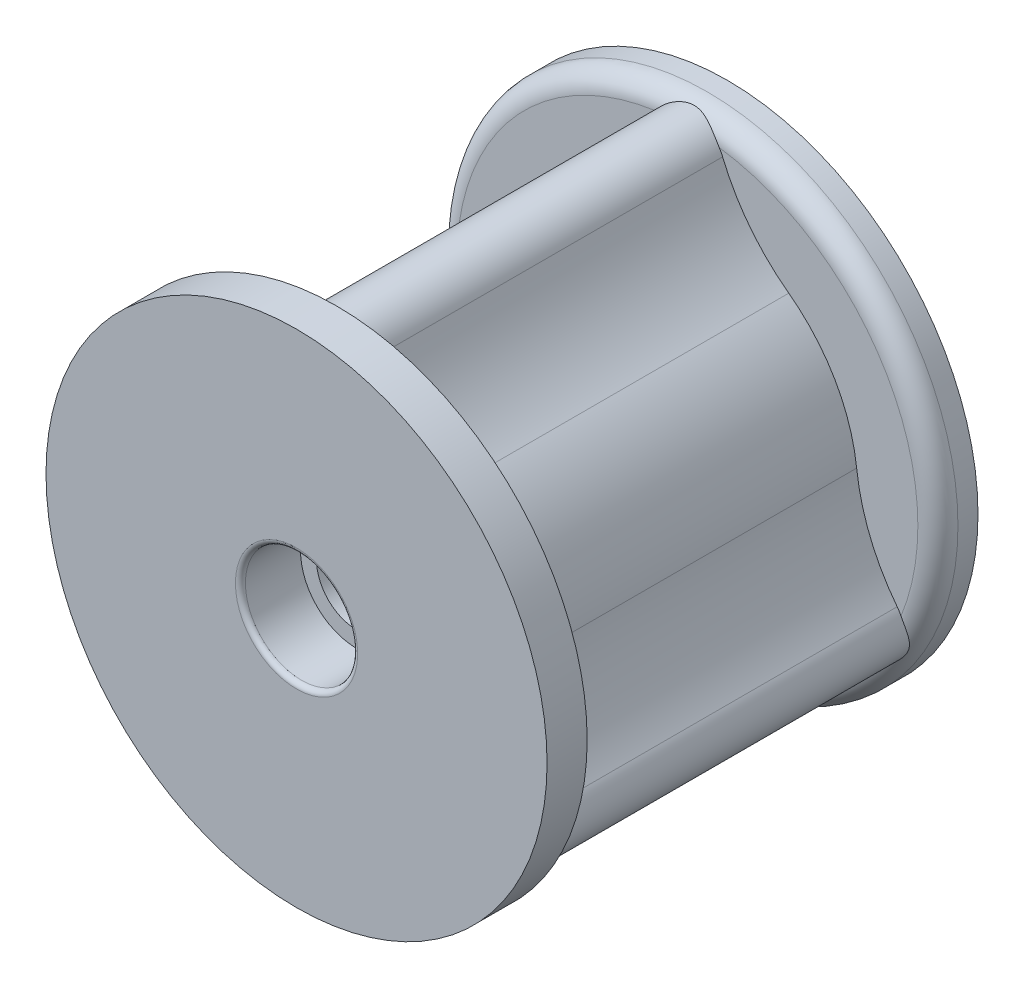
ISO-10303-21;
HEADER;
FILE_DESCRIPTION(('STEP AP214'),'2;1');
FILE_NAME('part.step','',(''),(''),'','','');
FILE_SCHEMA(('AUTOMOTIVE_DESIGN { 1 0 10303 214 1 1 1 1 }'));
ENDSEC;
DATA;
#1=APPLICATION_CONTEXT('core data for automotive mechanical design processes');
#2=APPLICATION_PROTOCOL_DEFINITION('international standard','automotive_design',2000,#1);
#3=PRODUCT_CONTEXT('',#1,'mechanical');
#4=PRODUCT('Part','Part','',(#3));
#5=PRODUCT_RELATED_PRODUCT_CATEGORY('part','',(#4));
#6=PRODUCT_DEFINITION_FORMATION('','',#4);
#7=PRODUCT_DEFINITION_CONTEXT('part definition',#1,'design');
#8=PRODUCT_DEFINITION('design','',#6,#7);
#9=PRODUCT_DEFINITION_SHAPE('','',#8);
#10=(LENGTH_UNIT() NAMED_UNIT(*) SI_UNIT(.MILLI.,.METRE.));
#11=(NAMED_UNIT(*) PLANE_ANGLE_UNIT() SI_UNIT($,.RADIAN.));
#12=(NAMED_UNIT(*) SI_UNIT($,.STERADIAN.) SOLID_ANGLE_UNIT());
#13=UNCERTAINTY_MEASURE_WITH_UNIT(LENGTH_MEASURE(1.E-05),#10,'distance_accuracy_value','');
#14=(GEOMETRIC_REPRESENTATION_CONTEXT(3) GLOBAL_UNCERTAINTY_ASSIGNED_CONTEXT((#13)) GLOBAL_UNIT_ASSIGNED_CONTEXT((#10,
#11,#12)) REPRESENTATION_CONTEXT('',''));
#15=CARTESIAN_POINT('',(0.,0.,0.));
#16=DIRECTION('',(0.,0.,1.));
#17=DIRECTION('',(1.,0.,0.));
#18=AXIS2_PLACEMENT_3D('',#15,#16,#17);
#19=CARTESIAN_POINT('',(0.,0.,11.1));
#20=DIRECTION('',(0.,0.,-1.));
#21=DIRECTION('',(-1.,0.,0.));
#22=AXIS2_PLACEMENT_3D('',#19,#20,#21);
#23=TOROIDAL_SURFACE('',#22,4.95,0.4);
#24=CARTESIAN_POINT('',(0.,0.,11.5));
#25=DIRECTION('',(0.,0.,-1.));
#26=DIRECTION('',(-1.,0.,0.));
#27=AXIS2_PLACEMENT_3D('',#24,#25,#26);
#28=CIRCLE('',#27,4.95);
#29=CARTESIAN_POINT('',(-4.95,0.,11.5));
#30=VERTEX_POINT('',#29);
#31=EDGE_CURVE('E46',#30,#30,#28,.T.);
#32=ORIENTED_EDGE('',*,*,#31,.F.);
#33=EDGE_LOOP('',(#32));
#34=FACE_BOUND('',#33,.T.);
#35=CARTESIAN_POINT('',(0.,0.,11.1));
#36=DIRECTION('',(0.,0.,-1.));
#37=DIRECTION('',(-1.,0.,0.));
#38=AXIS2_PLACEMENT_3D('',#35,#36,#37);
#39=CIRCLE('',#38,5.35);
#40=CARTESIAN_POINT('',(-5.35,0.,11.1));
#41=VERTEX_POINT('',#40);
#42=EDGE_CURVE('E11',#41,#41,#39,.F.);
#43=ORIENTED_EDGE('',*,*,#42,.F.);
#44=EDGE_LOOP('',(#43));
#45=FACE_BOUND('',#44,.T.);
#46=ADVANCED_FACE('F39',(#34,#45),#23,.F.);
#47=CARTESIAN_POINT('',(0.,0.,1.));
#48=DIRECTION('',(0.,0.,1.));
#49=DIRECTION('',(1.,0.,0.));
#50=AXIS2_PLACEMENT_3D('',#47,#48,#49);
#51=TOROIDAL_SURFACE('',#50,11.5,1.);
#52=CARTESIAN_POINT('',(0.,0.,1.));
#53=DIRECTION('',(0.,0.,1.));
#54=DIRECTION('',(1.,0.,0.));
#55=AXIS2_PLACEMENT_3D('',#52,#53,#54);
#56=CIRCLE('',#55,12.5);
#57=CARTESIAN_POINT('',(12.5,0.,1.));
#58=VERTEX_POINT('',#57);
#59=EDGE_CURVE('E270',#58,#58,#56,.F.);
#60=ORIENTED_EDGE('',*,*,#59,.F.);
#61=EDGE_LOOP('',(#60));
#62=FACE_BOUND('',#61,.T.);
#63=CARTESIAN_POINT('',(-10.6588030535764,-4.31739707058197,2.));
#64=CARTESIAN_POINT('',(-10.6781101839333,-4.35555452923911,1.99999498434355));
#65=CARTESIAN_POINT('',(-10.6960985329721,-4.39432755074247,1.99844404990182));
#66=CARTESIAN_POINT('',(-10.7293402997143,-4.4727673464099,1.99271772835113));
#67=CARTESIAN_POINT('',(-10.7445983178298,-4.51243248798381,1.98854681025949));
#68=CARTESIAN_POINT('',(-10.7860009225556,-4.63181918287956,1.97287780415423));
#69=CARTESIAN_POINT('',(-10.8080845346889,-4.71255084896907,1.95820828314791));
#70=CARTESIAN_POINT('',(-10.8462832488853,-4.89900725901992,1.91845858803093));
#71=CARTESIAN_POINT('',(-10.8587148337109,-5.00507811925763,1.89158379576156));
#72=CARTESIAN_POINT('',(-10.8658729259182,-5.21746496130839,1.83492284551103));
#73=CARTESIAN_POINT('',(-10.8605222258494,-5.32378000398095,1.80512453837247));
#74=CARTESIAN_POINT('',(-10.834223080376,-5.51846515052636,1.75360148359661));
#75=CARTESIAN_POINT('',(-10.8158448053257,-5.60704145234437,1.73134291199219));
#76=CARTESIAN_POINT('',(-10.7660969189572,-5.7818991562095,1.69436355342532));
#77=CARTESIAN_POINT('',(-10.7347867937073,-5.86818916573531,1.67960893313134));
#78=CARTESIAN_POINT('',(-10.6780654079738,-5.99474389681366,1.66636353358436));
#79=CARTESIAN_POINT('',(-10.6573706200874,-6.03670335303288,1.66343977103681));
#80=CARTESIAN_POINT('',(-10.6128874244484,-6.1190631104157,1.66090308510507));
#81=CARTESIAN_POINT('',(-10.5890992626566,-6.15946353521035,1.66128989864829));
#82=CARTESIAN_POINT('',(-10.5386473646156,-6.23833187567565,1.66534821128953));
#83=CARTESIAN_POINT('',(-10.5119794294053,-6.27679684623886,1.66902456527575));
#84=CARTESIAN_POINT('',(-10.4560825729752,-6.35142054093743,1.6793040575289));
#85=CARTESIAN_POINT('',(-10.4268519474946,-6.38757770227402,1.68590915552067));
#86=CARTESIAN_POINT('',(-10.3294562915159,-6.49946142069352,1.71088803936606));
#87=CARTESIAN_POINT('',(-10.2568364611818,-6.57034149263342,1.73385001352676));
#88=CARTESIAN_POINT('',(-10.1022616064596,-6.69917315548325,1.78455790579169));
#89=CARTESIAN_POINT('',(-10.0202781669791,-6.75708372528154,1.81231852429326));
#90=CARTESIAN_POINT('',(-9.84547983314278,-6.86096797336868,1.86762708490789));
#91=CARTESIAN_POINT('',(-9.75242072241659,-6.90654915830803,1.89514579576109));
#92=CARTESIAN_POINT('',(-9.55899678631057,-6.98218362630873,1.94344609292167));
#93=CARTESIAN_POINT('',(-9.45867629686389,-7.01232334494671,1.96426493314531));
#94=CARTESIAN_POINT('',(-9.28663137965699,-7.048624700969,1.98848585953015));
#95=CARTESIAN_POINT('',(-9.21639414408376,-7.0594167802046,1.99536820421943));
#96=CARTESIAN_POINT('',(-9.10994029578974,-7.0696772861725,1.99985289916632));
#97=CARTESIAN_POINT('',(-9.0741189842099,-7.07210704694329,2.00036427411822));
#98=CARTESIAN_POINT('',(-9.00238704104726,-7.07493995266375,1.99911309751472));
#99=CARTESIAN_POINT('',(-8.96647635525176,-7.07534015573206,1.99734724972726));
#100=CARTESIAN_POINT('',(-8.93066354132666,-7.0747185975918,1.99429648470368));
#101=B_SPLINE_CURVE_WITH_KNOTS('',3,(#63,#64,#65,#66,#67,#68,#69,#70,#71,#72,#73,#74,#75,#76,
#77,#78,#79,#80,#81,#82,#83,#84,#85,#86,#87,#88,#89,#90,#91,#92,#93,#94,#95,#96,#97,#98,#99,
#100),.UNSPECIFIED.,.F.,.F.,(4,2,2,2,2,2,2,2,2,2,2,2,2,2,2,2,2,2,4),(0.,0.128166756814913,
0.256115485608044,0.509963693243546,0.83871022167859,1.16888596936918,1.44742605879382,
1.72469889639607,1.865112929277,2.00551580435938,2.1461262362799,2.28683089786786,
2.59716304170232,2.90846328896911,3.22874279115222,3.54720934339071,3.76059047451701,
3.86819416667734,3.97595378788394),.UNSPECIFIED.);
#102=CARTESIAN_POINT('',(-10.6588030535764,-4.31739707058197,2.));
#103=VERTEX_POINT('',#102);
#104=CARTESIAN_POINT('',(-9.06837706813587,-7.07209568304244,2.));
#105=VERTEX_POINT('',#104);
#106=EDGE_CURVE('E298',#103,#105,#101,.T.);
#107=ORIENTED_EDGE('',*,*,#106,.F.);
#108=CARTESIAN_POINT('',(0.,0.,2.));
#109=DIRECTION('',(0.,0.,1.));
#110=DIRECTION('',(1.,0.,0.));
#111=AXIS2_PLACEMENT_3D('',#108,#109,#110);
#112=CIRCLE('',#111,11.5);
#113=CARTESIAN_POINT('',(-1.59042598544066,11.3894927536232,2.));
#114=VERTEX_POINT('',#113);
#115=EDGE_CURVE('E257',#114,#103,#112,.T.);
#116=ORIENTED_EDGE('',*,*,#115,.F.);
#117=CARTESIAN_POINT('',(1.59042598544066,11.3894927536232,2.));
#118=CARTESIAN_POINT('',(1.56703422207815,11.425291948315,1.99999498434355));
#119=CARTESIAN_POINT('',(1.54244997499418,11.4602568263064,1.99844404990182));
#120=CARTESIAN_POINT('',(1.49114000264963,11.5282649386056,1.99271772835113));
#121=CARTESIAN_POINT('',(1.4644179914597,11.561311340692,1.98854681025949));
#122=CARTESIAN_POINT('',(1.38172738316904,11.6568603956152,1.97287780415422));
#123=CARTESIAN_POINT('',(1.32285351551236,11.7163511977748,1.95820828314789));
#124=CARTESIAN_POINT('',(1.1804768848081,11.8426604596862,1.91845858803089));
#125=CARTESIAN_POINT('',(1.09483261765381,11.9064619580734,1.8915837957615));
#126=CARTESIAN_POINT('',(0.914479263111988,12.0188544687929,1.83492284551094));
#127=CARTESIAN_POINT('',(0.819732385318757,12.0673781479416,1.80512453837235));
#128=CARTESIAN_POINT('',(0.637980529934278,12.1419449931366,1.75360148359643));
#129=CARTESIAN_POINT('',(0.552082064861464,12.1703170909744,1.73134291199198));
#130=CARTESIAN_POINT('',(0.375776908082598,12.2146630095273,1.69436355342504));
#131=CARTESIAN_POINT('',(0.285392505115499,12.2306926504281,1.67960893313103));
#132=CARTESIAN_POINT('',(0.147432200165786,12.2448478549843,1.666363533584));
#133=CARTESIAN_POINT('',(0.100746851207737,12.2479053710583,1.66343977103643));
#134=CARTESIAN_POINT('',(0.00717961124519466,12.2505616722849,1.66090308510467));
#135=CARTESIAN_POINT('',(-0.0397022638465764,12.2501607322612,1.66128989864788));
#136=CARTESIAN_POINT('',(-0.133230199264361,12.2459022771212,1.6653482112891));
#137=CARTESIAN_POINT('',(-0.179875808533073,12.2420396530443,1.66902456527531));
#138=CARTESIAN_POINT('',(-0.272450252081365,12.2309434027334,1.67930405752845));
#139=CARTESIAN_POINT('',(-0.318378585067886,12.223707519167,1.68590915552022));
#140=CARTESIAN_POINT('',(-0.463970555478371,12.195302266081,1.71088803936561));
#141=CARTESIAN_POINT('',(-0.561664413567418,12.1678516841632,1.73385001352631));
#142=CARTESIAN_POINT('',(-0.750523333768205,12.0984017646125,1.78455790579126));
#143=CARTESIAN_POINT('',(-0.841667078101412,12.0563573082319,1.81231852429284));
#144=CARTESIAN_POINT('',(-1.01903264291605,11.9569196346341,1.86762708490751));
#145=CARTESIAN_POINT('',(-1.10503666237121,11.8991186731614,1.89514579576073));
#146=CARTESIAN_POINT('',(-1.26725000111456,11.7694258647941,1.94344609292139));
#147=CARTESIAN_POINT('',(-1.34351200784131,11.6976156317322,1.96426493314507));
#148=CARTESIAN_POINT('',(-1.46097236295196,11.5667710408502,1.98848585953001));
#149=CARTESIAN_POINT('',(-1.5054371955163,11.51133985017,1.99536820421934));
#150=CARTESIAN_POINT('',(-1.56754997848726,11.4242783662007,1.99985289916629));
#151=CARTESIAN_POINT('',(-1.58756486882983,11.3944710807611,2.00036427411821));
#152=CARTESIAN_POINT('',(-1.62588420873164,11.3337658485796,1.99911309751477));
#153=CARTESIAN_POINT('',(-1.64418613765324,11.3028663839476,1.99734724972733));
#154=CARTESIAN_POINT('',(-1.66155425947642,11.2715407982373,1.99429648470376));
#155=B_SPLINE_CURVE_WITH_KNOTS('',3,(#117,#118,#119,#120,#121,#122,#123,#124,#125,#126,#127,
#128,#129,#130,#131,#132,#133,#134,#135,#136,#137,#138,#139,#140,#141,#142,#143,#144,#145,#146,
#147,#148,#149,#150,#151,#152,#153,#154),.UNSPECIFIED.,.F.,.F.,(4,2,2,2,2,2,2,2,2,2,2,2,2,2,2,2,
2,2,4),(0.,0.128166756814914,0.256115485608046,0.50996369324355,0.83871022167858,
1.16888596936916,1.44742605879383,1.72469889639611,1.86511292927706,2.00551580435946,
2.14612623628,2.28683089786798,2.59716304170234,2.90846328896904,3.22874279115209,
3.5472093433905,3.76059047451691,3.8681941666773,3.97595378788396),.UNSPECIFIED.);
#156=CARTESIAN_POINT('',(1.59042598544066,11.3894927536232,2.));
#157=VERTEX_POINT('',#156);
#158=EDGE_CURVE('E52',#157,#114,#155,.T.);
#159=ORIENTED_EDGE('',*,*,#158,.F.);
#160=CARTESIAN_POINT('',(0.,0.,2.));
#161=DIRECTION('',(0.,0.,1.));
#162=DIRECTION('',(1.,0.,0.));
#163=AXIS2_PLACEMENT_3D('',#160,#161,#162);
#164=CIRCLE('',#163,11.5);
#165=CARTESIAN_POINT('',(10.6588030535772,-4.3173970705802,2.));
#166=VERTEX_POINT('',#165);
#167=EDGE_CURVE('E265',#166,#157,#164,.T.);
#168=ORIENTED_EDGE('',*,*,#167,.F.);
#169=CARTESIAN_POINT('',(9.0683770681364,-7.07209568304176,2.));
#170=CARTESIAN_POINT('',(9.11107596185577,-7.06973741907642,1.99999498434355));
#171=CARTESIAN_POINT('',(9.15364855797857,-7.06592927556451,1.99844404990182));
#172=CARTESIAN_POINT('',(9.23820029706532,-7.05549759219624,1.99271772835113));
#173=CARTESIAN_POINT('',(9.28018032637079,-7.04887885270876,1.98854681025948));
#174=CARTESIAN_POINT('',(9.40427353938728,-7.02504121273632,1.97287780415421));
#175=CARTESIAN_POINT('',(9.48523101917732,-7.0038003488064,1.95820828314787));
#176=CARTESIAN_POINT('',(9.66580636407798,-6.943653200667,1.91845858803085));
#177=CARTESIAN_POINT('',(9.76388221605793,-6.9013838388165,1.89158379576145));
#178=CARTESIAN_POINT('',(9.9513936628071,-6.80138950748536,1.83492284551084));
#179=CARTESIAN_POINT('',(10.0407898405316,-6.74359814396154,1.80512453837223));
#180=CARTESIAN_POINT('',(10.1962425504428,-6.62347984261116,1.75360148359625));
#181=CARTESIAN_POINT('',(10.2637627404653,-6.5632756386309,1.73134291199177));
#182=CARTESIAN_POINT('',(10.3903200108758,-6.43276385331868,1.69436355342476));
#183=CARTESIAN_POINT('',(10.449394288593,-6.36250348469372,1.67960893313071));
#184=CARTESIAN_POINT('',(10.5306332078093,-6.2501039581715,1.66636353358363));
#185=CARTESIAN_POINT('',(10.5566237688809,-6.21120201802632,1.66343977103605));
#186=CARTESIAN_POINT('',(10.6057078132045,-6.13149856187005,1.66090308510426));
#187=CARTESIAN_POINT('',(10.6288015265045,-6.09069719705166,1.66128989864746));
#188=CARTESIAN_POINT('',(10.6718775638814,-6.00757040144637,1.66534821128866));
#189=CARTESIAN_POINT('',(10.6918552379398,-5.96524280680617,1.66902456527487));
#190=CARTESIAN_POINT('',(10.728532825058,-5.8795228617967,1.67930405752801));
#191=CARTESIAN_POINT('',(10.7452305325639,-5.8361298168937,1.68590915551977));
#192=CARTESIAN_POINT('',(10.7934268469958,-5.69584084538822,1.71088803936516));
#193=CARTESIAN_POINT('',(10.8185008747508,-5.59751019153051,1.73385001352586));
#194=CARTESIAN_POINT('',(10.8527849402295,-5.39922860913006,1.78455790579082));
#195=CARTESIAN_POINT('',(10.8619452450823,-5.29927358295121,1.81231852429242));
#196=CARTESIAN_POINT('',(10.8645124760608,-5.09595166126636,1.86762708490713));
#197=CARTESIAN_POINT('',(10.8574573847898,-4.99256951485428,1.89514579576038));
#198=CARTESIAN_POINT('',(10.8262467874273,-4.78724223848623,1.9434460929211));
#199=CARTESIAN_POINT('',(10.8021883047075,-4.68529228678637,1.96426493314483));
#200=CARTESIAN_POINT('',(10.7476037426113,-4.51814633988201,1.98848585952987));
#201=CARTESIAN_POINT('',(10.7218313396024,-4.45192306996612,1.99536820421924));
#202=CARTESIAN_POINT('',(10.6774902742793,-4.35460108002881,1.99985289916626));
#203=CARTESIAN_POINT('',(10.661683853042,-4.32236403381835,2.00036427411821));
#204=CARTESIAN_POINT('',(10.6282712497812,-4.25882589591636,1.99911309751481));
#205=CARTESIAN_POINT('',(10.6106624929072,-4.22752622821593,1.99734724972739));
#206=CARTESIAN_POINT('',(10.5922178008053,-4.19682220064587,1.99429648470385));
#207=B_SPLINE_CURVE_WITH_KNOTS('',3,(#169,#170,#171,#172,#173,#174,#175,#176,#177,#178,#179,
#180,#181,#182,#183,#184,#185,#186,#187,#188,#189,#190,#191,#192,#193,#194,#195,#196,#197,#198,
#199,#200,#201,#202,#203,#204,#205,#206),.UNSPECIFIED.,.F.,.F.,(4,2,2,2,2,2,2,2,2,2,2,2,2,2,2,2,
2,2,4),(0.,0.128166756814917,0.256115485608051,0.509963693243554,0.838710221678569,
1.16888596936914,1.44742605879383,1.72469889639615,1.86511292927712,2.00551580435954,
2.1461262362801,2.2868308978681,2.59716304170237,2.90846328896897,3.22874279115195,
3.5472093433903,3.76059047451682,3.86819416667727,3.97595378788398),.UNSPECIFIED.);
#208=CARTESIAN_POINT('',(9.0683770681364,-7.07209568304176,2.));
#209=VERTEX_POINT('',#208);
#210=EDGE_CURVE('E269',#209,#166,#207,.T.);
#211=ORIENTED_EDGE('',*,*,#210,.F.);
#212=CARTESIAN_POINT('',(0.,0.,2.));
#213=DIRECTION('',(0.,0.,1.));
#214=DIRECTION('',(1.,0.,0.));
#215=AXIS2_PLACEMENT_3D('',#212,#213,#214);
#216=CIRCLE('',#215,11.5);
#217=EDGE_CURVE('E261',#105,#209,#216,.T.);
#218=ORIENTED_EDGE('',*,*,#217,.F.);
#219=EDGE_LOOP('',(#107,#116,#159,#168,#211,#218));
#220=FACE_BOUND('',#219,.T.);
#221=ADVANCED_FACE('F286',(#62,#220),#51,.T.);
#222=CARTESIAN_POINT('',(0.,0.,2.));
#223=DIRECTION('',(0.,0.,1.));
#224=DIRECTION('',(1.,0.,0.));
#225=AXIS2_PLACEMENT_3D('',#222,#223,#224);
#226=PLANE('',#225);
#227=CARTESIAN_POINT('',(-8.96336292916832,-5.17500000000036,2.));
#228=DIRECTION('',(0.,0.,1.));
#229=DIRECTION('',(1.,0.,0.));
#230=AXIS2_PLACEMENT_3D('',#227,#228,#229);
#231=CIRCLE('',#230,1.9);
#232=CARTESIAN_POINT('',(-8.70916976048938,-7.05791949721657,2.));
#233=VERTEX_POINT('',#232);
#234=EDGE_CURVE('E184',#105,#233,#231,.T.);
#235=ORIENTED_EDGE('',*,*,#234,.F.);
#236=ORIENTED_EDGE('',*,*,#217,.T.);
#237=CARTESIAN_POINT('',(8.96336292916957,-5.17499999999964,2.));
#238=DIRECTION('',(0.,0.,1.));
#239=DIRECTION('',(1.,0.,0.));
#240=AXIS2_PLACEMENT_3D('',#237,#238,#239);
#241=CIRCLE('',#240,1.9);
#242=CARTESIAN_POINT('',(8.70916976049067,-7.05791949721586,2.));
#243=VERTEX_POINT('',#242);
#244=EDGE_CURVE('E420',#243,#209,#241,.T.);
#245=ORIENTED_EDGE('',*,*,#244,.F.);
#246=CARTESIAN_POINT('',(7.37131097797014,-16.9680221141433,2.));
#247=DIRECTION('',(0.,0.,1.));
#248=DIRECTION('',(1.,0.,0.));
#249=AXIS2_PLACEMENT_3D('',#246,#247,#248);
#250=CIRCLE('',#249,10.);
#251=CARTESIAN_POINT('',(3.38681855744574,-7.79611826866045,2.));
#252=VERTEX_POINT('',#251);
#253=EDGE_CURVE('E253',#243,#252,#250,.T.);
#254=ORIENTED_EDGE('',*,*,#253,.T.);
#255=CARTESIAN_POINT('',(0.,0.,2.));
#256=DIRECTION('',(0.,0.,1.));
#257=DIRECTION('',(1.,0.,0.));
#258=AXIS2_PLACEMENT_3D('',#255,#256,#257);
#259=CIRCLE('',#258,8.5);
#260=CARTESIAN_POINT('',(-3.38681855744503,-7.79611826866076,2.));
#261=VERTEX_POINT('',#260);
#262=EDGE_CURVE('E176',#261,#252,#259,.T.);
#263=ORIENTED_EDGE('',*,*,#262,.F.);
#264=CARTESIAN_POINT('',(-7.37131097796858,-16.968022114144,2.));
#265=DIRECTION('',(0.,0.,1.));
#266=DIRECTION('',(1.,0.,0.));
#267=AXIS2_PLACEMENT_3D('',#264,#265,#266);
#268=CIRCLE('',#267,10.);
#269=EDGE_CURVE('E211',#261,#233,#268,.T.);
#270=ORIENTED_EDGE('',*,*,#269,.T.);
#271=EDGE_LOOP('',(#235,#236,#245,#254,#263,#270));
#272=FACE_BOUND('',#271,.T.);
#273=ADVANCED_FACE('F289',(#272),#226,.T.);
#274=CARTESIAN_POINT('',(10.4669224627002,-4.01340250984696,2.));
#275=VERTEX_POINT('',#274);
#276=EDGE_CURVE('E423',#166,#275,#241,.T.);
#277=ORIENTED_EDGE('',*,*,#276,.F.);
#278=ORIENTED_EDGE('',*,*,#167,.T.);
#279=CARTESIAN_POINT('',(0.,10.35,2.));
#280=DIRECTION('',(0.,0.,1.));
#281=DIRECTION('',(1.,0.,0.));
#282=AXIS2_PLACEMENT_3D('',#279,#280,#281);
#283=CIRCLE('',#282,1.9);
#284=CARTESIAN_POINT('',(1.75775270220973,11.0713220070637,2.));
#285=VERTEX_POINT('',#284);
#286=EDGE_CURVE('E406',#285,#157,#283,.T.);
#287=ORIENTED_EDGE('',*,*,#286,.F.);
#288=CARTESIAN_POINT('',(11.0090827138399,14.8677536231884,2.));
#289=DIRECTION('',(0.,0.,1.));
#290=DIRECTION('',(1.,0.,0.));
#291=AXIS2_PLACEMENT_3D('',#288,#289,#290);
#292=CIRCLE('',#291,10.);
#293=CARTESIAN_POINT('',(5.05822719284535,6.83113004308657,2.));
#294=VERTEX_POINT('',#293);
#295=EDGE_CURVE('E225',#285,#294,#292,.T.);
#296=ORIENTED_EDGE('',*,*,#295,.T.);
#297=CARTESIAN_POINT('',(8.44504575029066,0.964988225574672,2.));
#298=VERTEX_POINT('',#297);
#299=EDGE_CURVE('E178',#298,#294,#259,.T.);
#300=ORIENTED_EDGE('',*,*,#299,.F.);
#301=CARTESIAN_POINT('',(18.3803936918091,2.10026849095663,2.));
#302=DIRECTION('',(0.,0.,1.));
#303=DIRECTION('',(1.,0.,0.));
#304=AXIS2_PLACEMENT_3D('',#301,#302,#303);
#305=CIRCLE('',#304,10.);
#306=EDGE_CURVE('E246',#298,#275,#305,.T.);
#307=ORIENTED_EDGE('',*,*,#306,.T.);
#308=EDGE_LOOP('',(#277,#278,#287,#296,#300,#307));
#309=FACE_BOUND('',#308,.T.);
#310=ADVANCED_FACE('F308',(#309),#226,.T.);
#311=CARTESIAN_POINT('',(7.37131097797014,-16.9680221141433,19.5));
#312=DIRECTION('',(0.,0.,-1.));
#313=DIRECTION('',(-1.,0.,0.));
#314=AXIS2_PLACEMENT_3D('',#311,#312,#313);
#315=CYLINDRICAL_SURFACE('',#314,10.);
#316=DIRECTION('',(0.,0.,-1.));
#317=VECTOR('',#316,1.);
#318=CARTESIAN_POINT('',(3.38681855744574,-7.79611826866045,34.7916305603426));
#319=LINE('',#318,#317);
#320=CARTESIAN_POINT('',(3.38681855744574,-7.79611826866045,19.5));
#321=VERTEX_POINT('',#320);
#322=EDGE_CURVE('E248',#252,#321,#319,.F.);
#323=ORIENTED_EDGE('',*,*,#322,.F.);
#324=ORIENTED_EDGE('',*,*,#253,.F.);
#325=DIRECTION('',(0.,0.,-1.));
#326=VECTOR('',#325,1.);
#327=CARTESIAN_POINT('',(8.70916976049067,-7.05791949721586,19.5));
#328=LINE('',#327,#326);
#329=CARTESIAN_POINT('',(8.70916976049067,-7.05791949721586,19.5));
#330=VERTEX_POINT('',#329);
#331=EDGE_CURVE('E255',#330,#243,#328,.T.);
#332=ORIENTED_EDGE('',*,*,#331,.F.);
#333=CARTESIAN_POINT('',(7.37131097797014,-16.9680221141433,19.5));
#334=DIRECTION('',(0.,0.,-1.));
#335=DIRECTION('',(-1.,0.,0.));
#336=AXIS2_PLACEMENT_3D('',#333,#334,#335);
#337=CIRCLE('',#336,10.);
#338=EDGE_CURVE('E260',#321,#330,#337,.T.);
#339=ORIENTED_EDGE('',*,*,#338,.F.);
#340=EDGE_LOOP('',(#323,#324,#332,#339));
#341=FACE_BOUND('',#340,.T.);
#342=ADVANCED_FACE('F292',(#341),#315,.F.);
#343=CARTESIAN_POINT('',(18.3803936918091,2.10026849095663,19.5));
#344=DIRECTION('',(0.,0.,1.));
#345=DIRECTION('',(1.,0.,0.));
#346=AXIS2_PLACEMENT_3D('',#343,#344,#345);
#347=CYLINDRICAL_SURFACE('',#346,10.);
#348=DIRECTION('',(0.,0.,-1.));
#349=VECTOR('',#348,1.);
#350=CARTESIAN_POINT('',(8.44504575029066,0.964988225574669,34.7916305603426));
#351=LINE('',#350,#349);
#352=CARTESIAN_POINT('',(8.44504575029066,0.964988225574672,19.5));
#353=VERTEX_POINT('',#352);
#354=EDGE_CURVE('E238',#353,#298,#351,.T.);
#355=ORIENTED_EDGE('',*,*,#354,.F.);
#356=CARTESIAN_POINT('',(18.3803936918091,2.10026849095663,19.5));
#357=DIRECTION('',(0.,0.,-1.));
#358=DIRECTION('',(-1.,0.,0.));
#359=AXIS2_PLACEMENT_3D('',#356,#357,#358);
#360=CIRCLE('',#359,10.);
#361=CARTESIAN_POINT('',(10.4669224627002,-4.01340250984696,19.5));
#362=VERTEX_POINT('',#361);
#363=EDGE_CURVE('E242',#362,#353,#360,.T.);
#364=ORIENTED_EDGE('',*,*,#363,.F.);
#365=DIRECTION('',(0.,0.,-1.));
#366=VECTOR('',#365,1.);
#367=CARTESIAN_POINT('',(10.4669224627002,-4.01340250984696,19.5));
#368=LINE('',#367,#366);
#369=EDGE_CURVE('E241',#275,#362,#368,.F.);
#370=ORIENTED_EDGE('',*,*,#369,.F.);
#371=ORIENTED_EDGE('',*,*,#306,.F.);
#372=EDGE_LOOP('',(#355,#364,#370,#371));
#373=FACE_BOUND('',#372,.T.);
#374=ADVANCED_FACE('F338',(#373),#347,.F.);
#375=CARTESIAN_POINT('',(-11.0090827138399,14.8677536231884,19.5));
#376=DIRECTION('',(0.,0.,1.));
#377=DIRECTION('',(1.,0.,0.));
#378=AXIS2_PLACEMENT_3D('',#375,#376,#377);
#379=CYLINDRICAL_SURFACE('',#378,10.);
#380=DIRECTION('',(0.,0.,-1.));
#381=VECTOR('',#380,1.);
#382=CARTESIAN_POINT('',(-5.05822719284535,6.83113004308657,34.7916305603426));
#383=LINE('',#382,#381);
#384=CARTESIAN_POINT('',(-5.05822719284534,6.83113004308657,19.5));
#385=VERTEX_POINT('',#384);
#386=CARTESIAN_POINT('',(-5.05822719284534,6.83113004308657,2.));
#387=VERTEX_POINT('',#386);
#388=EDGE_CURVE('E227',#385,#387,#383,.T.);
#389=ORIENTED_EDGE('',*,*,#388,.F.);
#390=CARTESIAN_POINT('',(-11.0090827138399,14.8677536231884,19.5));
#391=DIRECTION('',(0.,0.,-1.));
#392=DIRECTION('',(-1.,0.,0.));
#393=AXIS2_PLACEMENT_3D('',#390,#391,#392);
#394=CIRCLE('',#393,10.);
#395=CARTESIAN_POINT('',(-1.75775270220973,11.0713220070637,19.5));
#396=VERTEX_POINT('',#395);
#397=EDGE_CURVE('E231',#396,#385,#394,.T.);
#398=ORIENTED_EDGE('',*,*,#397,.F.);
#399=DIRECTION('',(0.,0.,-1.));
#400=VECTOR('',#399,1.);
#401=CARTESIAN_POINT('',(-1.75775270220973,11.0713220070637,19.5));
#402=LINE('',#401,#400);
#403=CARTESIAN_POINT('',(-1.75775270220973,11.0713220070637,2.));
#404=VERTEX_POINT('',#403);
#405=EDGE_CURVE('E229',#404,#396,#402,.F.);
#406=ORIENTED_EDGE('',*,*,#405,.F.);
#407=CARTESIAN_POINT('',(-11.0090827138399,14.8677536231884,2.));
#408=DIRECTION('',(0.,0.,1.));
#409=DIRECTION('',(1.,0.,0.));
#410=AXIS2_PLACEMENT_3D('',#407,#408,#409);
#411=CIRCLE('',#410,10.);
#412=EDGE_CURVE('E232',#387,#404,#411,.T.);
#413=ORIENTED_EDGE('',*,*,#412,.F.);
#414=EDGE_LOOP('',(#389,#398,#406,#413));
#415=FACE_BOUND('',#414,.T.);
#416=ADVANCED_FACE('F340',(#415),#379,.F.);
#417=CARTESIAN_POINT('',(11.0090827138399,14.8677536231884,19.5));
#418=DIRECTION('',(0.,0.,-1.));
#419=DIRECTION('',(-1.,0.,0.));
#420=AXIS2_PLACEMENT_3D('',#417,#418,#419);
#421=CYLINDRICAL_SURFACE('',#420,10.);
#422=DIRECTION('',(0.,0.,-1.));
#423=VECTOR('',#422,1.);
#424=CARTESIAN_POINT('',(5.05822719284535,6.83113004308657,34.7916305603426));
#425=LINE('',#424,#423);
#426=CARTESIAN_POINT('',(5.05822719284535,6.83113004308657,19.5));
#427=VERTEX_POINT('',#426);
#428=EDGE_CURVE('E217',#294,#427,#425,.F.);
#429=ORIENTED_EDGE('',*,*,#428,.F.);
#430=ORIENTED_EDGE('',*,*,#295,.F.);
#431=DIRECTION('',(0.,0.,-1.));
#432=VECTOR('',#431,1.);
#433=CARTESIAN_POINT('',(1.75775270220973,11.0713220070637,19.5));
#434=LINE('',#433,#432);
#435=CARTESIAN_POINT('',(1.75775270220973,11.0713220070637,19.5));
#436=VERTEX_POINT('',#435);
#437=EDGE_CURVE('E216',#436,#285,#434,.T.);
#438=ORIENTED_EDGE('',*,*,#437,.F.);
#439=CARTESIAN_POINT('',(11.0090827138399,14.8677536231884,19.5));
#440=DIRECTION('',(0.,0.,-1.));
#441=DIRECTION('',(-1.,0.,0.));
#442=AXIS2_PLACEMENT_3D('',#439,#440,#441);
#443=CIRCLE('',#442,10.);
#444=EDGE_CURVE('E224',#427,#436,#443,.T.);
#445=ORIENTED_EDGE('',*,*,#444,.F.);
#446=EDGE_LOOP('',(#429,#430,#438,#445));
#447=FACE_BOUND('',#446,.T.);
#448=ADVANCED_FACE('F333',(#447),#421,.F.);
#449=CARTESIAN_POINT('',(-7.37131097796858,-16.968022114144,19.5));
#450=DIRECTION('',(0.,0.,1.));
#451=DIRECTION('',(1.,0.,0.));
#452=AXIS2_PLACEMENT_3D('',#449,#450,#451);
#453=CYLINDRICAL_SURFACE('',#452,10.);
#454=DIRECTION('',(0.,0.,-1.));
#455=VECTOR('',#454,1.);
#456=CARTESIAN_POINT('',(-3.38681855744502,-7.79611826866076,34.7916305603426));
#457=LINE('',#456,#455);
#458=CARTESIAN_POINT('',(-3.38681855744503,-7.79611826866076,19.5));
#459=VERTEX_POINT('',#458);
#460=EDGE_CURVE('E210',#459,#261,#457,.T.);
#461=ORIENTED_EDGE('',*,*,#460,.F.);
#462=CARTESIAN_POINT('',(-7.37131097796858,-16.968022114144,19.5));
#463=DIRECTION('',(0.,0.,-1.));
#464=DIRECTION('',(-1.,0.,0.));
#465=AXIS2_PLACEMENT_3D('',#462,#463,#464);
#466=CIRCLE('',#465,10.);
#467=CARTESIAN_POINT('',(-8.70916976048938,-7.05791949721657,19.5));
#468=VERTEX_POINT('',#467);
#469=EDGE_CURVE('E213',#468,#459,#466,.T.);
#470=ORIENTED_EDGE('',*,*,#469,.F.);
#471=DIRECTION('',(0.,0.,-1.));
#472=VECTOR('',#471,1.);
#473=CARTESIAN_POINT('',(-8.70916976048937,-7.05791949721657,19.5));
#474=LINE('',#473,#472);
#475=EDGE_CURVE('E167',#233,#468,#474,.F.);
#476=ORIENTED_EDGE('',*,*,#475,.F.);
#477=ORIENTED_EDGE('',*,*,#269,.F.);
#478=EDGE_LOOP('',(#461,#470,#476,#477));
#479=FACE_BOUND('',#478,.T.);
#480=ADVANCED_FACE('F328',(#479),#453,.F.);
#481=CARTESIAN_POINT('',(-18.3803936918094,2.1002684909539,34.7916305603426));
#482=DIRECTION('',(0.,0.,1.));
#483=DIRECTION('',(1.,0.,0.));
#484=AXIS2_PLACEMENT_3D('',#481,#482,#483);
#485=CYLINDRICAL_SURFACE('',#484,10.);
#486=DIRECTION('',(0.,0.,-1.));
#487=VECTOR('',#486,1.);
#488=CARTESIAN_POINT('',(-10.4669224626992,-4.013402509848,19.5));
#489=LINE('',#488,#487);
#490=CARTESIAN_POINT('',(-10.4669224626992,-4.013402509848,19.5));
#491=VERTEX_POINT('',#490);
#492=CARTESIAN_POINT('',(-10.4669224626992,-4.013402509848,2.));
#493=VERTEX_POINT('',#492);
#494=EDGE_CURVE('E157',#491,#493,#489,.T.);
#495=ORIENTED_EDGE('',*,*,#494,.F.);
#496=CARTESIAN_POINT('',(-18.3803936918094,2.1002684909539,19.5));
#497=DIRECTION('',(0.,0.,-1.));
#498=DIRECTION('',(-1.,0.,0.));
#499=AXIS2_PLACEMENT_3D('',#496,#497,#498);
#500=CIRCLE('',#499,10.);
#501=CARTESIAN_POINT('',(-8.4450457502908,0.964988225573414,19.5));
#502=VERTEX_POINT('',#501);
#503=EDGE_CURVE('E144',#502,#491,#500,.T.);
#504=ORIENTED_EDGE('',*,*,#503,.F.);
#505=DIRECTION('',(0.,0.,-1.));
#506=VECTOR('',#505,1.);
#507=CARTESIAN_POINT('',(-8.4450457502908,0.964988225573412,34.7916305603426));
#508=LINE('',#507,#506);
#509=CARTESIAN_POINT('',(-8.4450457502908,0.964988225573414,2.));
#510=VERTEX_POINT('',#509);
#511=EDGE_CURVE('E156',#510,#502,#508,.F.);
#512=ORIENTED_EDGE('',*,*,#511,.F.);
#513=CARTESIAN_POINT('',(-18.3803936918094,2.1002684909539,2.));
#514=DIRECTION('',(0.,0.,1.));
#515=DIRECTION('',(1.,0.,0.));
#516=AXIS2_PLACEMENT_3D('',#513,#514,#515);
#517=CIRCLE('',#516,10.);
#518=EDGE_CURVE('E153',#493,#510,#517,.T.);
#519=ORIENTED_EDGE('',*,*,#518,.F.);
#520=EDGE_LOOP('',(#495,#504,#512,#519));
#521=FACE_BOUND('',#520,.T.);
#522=ADVANCED_FACE('F159',(#521),#485,.F.);
#523=CARTESIAN_POINT('',(0.,0.,21.25));
#524=DIRECTION('',(0.,0.,-1.));
#525=DIRECTION('',(-1.,0.,0.));
#526=AXIS2_PLACEMENT_3D('',#523,#524,#525);
#527=TOROIDAL_SURFACE('',#526,3.05,0.25);
#528=CARTESIAN_POINT('',(0.,0.,21.5));
#529=DIRECTION('',(0.,0.,-1.));
#530=DIRECTION('',(-1.,0.,0.));
#531=AXIS2_PLACEMENT_3D('',#528,#529,#530);
#532=CIRCLE('',#531,3.05);
#533=CARTESIAN_POINT('',(-3.05,0.,21.5));
#534=VERTEX_POINT('',#533);
#535=EDGE_CURVE('E200',#534,#534,#532,.T.);
#536=ORIENTED_EDGE('',*,*,#535,.F.);
#537=EDGE_LOOP('',(#536));
#538=FACE_BOUND('',#537,.T.);
#539=CARTESIAN_POINT('',(0.,0.,21.25));
#540=DIRECTION('',(0.,0.,-1.));
#541=DIRECTION('',(-1.,0.,0.));
#542=AXIS2_PLACEMENT_3D('',#539,#540,#541);
#543=CIRCLE('',#542,2.8);
#544=CARTESIAN_POINT('',(-2.8,0.,21.25));
#545=VERTEX_POINT('',#544);
#546=EDGE_CURVE('E164',#545,#545,#543,.F.);
#547=ORIENTED_EDGE('',*,*,#546,.F.);
#548=EDGE_LOOP('',(#547));
#549=FACE_BOUND('',#548,.T.);
#550=ADVANCED_FACE('F322',(#538,#549),#527,.T.);
#551=CARTESIAN_POINT('',(0.,0.,0.));
#552=DIRECTION('',(0.,0.,1.));
#553=DIRECTION('',(1.,0.,0.));
#554=AXIS2_PLACEMENT_3D('',#551,#552,#553);
#555=CYLINDRICAL_SURFACE('',#554,2.);
#556=CARTESIAN_POINT('',(0.,0.,11.5));
#557=DIRECTION('',(0.,0.,-1.));
#558=DIRECTION('',(-1.,0.,0.));
#559=AXIS2_PLACEMENT_3D('',#556,#557,#558);
#560=CIRCLE('',#559,2.);
#561=CARTESIAN_POINT('',(-2.,0.,11.5));
#562=VERTEX_POINT('',#561);
#563=EDGE_CURVE('E187',#562,#562,#560,.F.);
#564=ORIENTED_EDGE('',*,*,#563,.F.);
#565=EDGE_LOOP('',(#564));
#566=FACE_BOUND('',#565,.T.);
#567=CARTESIAN_POINT('',(0.,0.,18.5));
#568=DIRECTION('',(0.,0.,1.));
#569=DIRECTION('',(1.,0.,0.));
#570=AXIS2_PLACEMENT_3D('',#567,#568,#569);
#571=CIRCLE('',#570,2.);
#572=CARTESIAN_POINT('',(2.,0.,18.5));
#573=VERTEX_POINT('',#572);
#574=EDGE_CURVE('E188',#573,#573,#571,.F.);
#575=ORIENTED_EDGE('',*,*,#574,.F.);
#576=EDGE_LOOP('',(#575));
#577=FACE_BOUND('',#576,.T.);
#578=ADVANCED_FACE('F325',(#566,#577),#555,.F.);
#579=CARTESIAN_POINT('',(0.,0.,0.5));
#580=DIRECTION('',(0.,0.,1.));
#581=DIRECTION('',(1.,0.,0.));
#582=AXIS2_PLACEMENT_3D('',#579,#580,#581);
#583=TOROIDAL_SURFACE('',#582,5.85,0.5);
#584=CARTESIAN_POINT('',(0.,0.,0.5));
#585=DIRECTION('',(0.,0.,1.));
#586=DIRECTION('',(1.,0.,0.));
#587=AXIS2_PLACEMENT_3D('',#584,#585,#586);
#588=CIRCLE('',#587,5.35);
#589=CARTESIAN_POINT('',(5.35,0.,0.5));
#590=VERTEX_POINT('',#589);
#591=EDGE_CURVE('E193',#590,#590,#588,.F.);
#592=ORIENTED_EDGE('',*,*,#591,.F.);
#593=EDGE_LOOP('',(#592));
#594=FACE_BOUND('',#593,.T.);
#595=CARTESIAN_POINT('',(0.,0.,0.));
#596=DIRECTION('',(0.,0.,1.));
#597=DIRECTION('',(1.,0.,0.));
#598=AXIS2_PLACEMENT_3D('',#595,#596,#597);
#599=CIRCLE('',#598,5.85);
#600=CARTESIAN_POINT('',(5.85,0.,0.));
#601=VERTEX_POINT('',#600);
#602=EDGE_CURVE('E192',#601,#601,#599,.T.);
#603=ORIENTED_EDGE('',*,*,#602,.F.);
#604=EDGE_LOOP('',(#603));
#605=FACE_BOUND('',#604,.T.);
#606=ADVANCED_FACE('F316',(#594,#605),#583,.T.);
#607=CARTESIAN_POINT('',(0.,0.,19.5));
#608=DIRECTION('',(0.,0.,-1.));
#609=DIRECTION('',(1.,0.,0.));
#610=AXIS2_PLACEMENT_3D('',#607,#608,#609);
#611=PLANE('',#610);
#612=CARTESIAN_POINT('',(0.,0.,19.5));
#613=DIRECTION('',(0.,0.,1.));
#614=DIRECTION('',(1.,0.,0.));
#615=AXIS2_PLACEMENT_3D('',#612,#613,#614);
#616=CIRCLE('',#615,12.5);
#617=CARTESIAN_POINT('',(12.5,0.,19.5));
#618=VERTEX_POINT('',#617);
#619=EDGE_CURVE('E432',#618,#618,#616,.T.);
#620=ORIENTED_EDGE('',*,*,#619,.F.);
#621=EDGE_LOOP('',(#620));
#622=FACE_BOUND('',#621,.T.);
#623=CARTESIAN_POINT('',(0.,0.,19.5));
#624=DIRECTION('',(0.,0.,1.));
#625=DIRECTION('',(1.,0.,0.));
#626=AXIS2_PLACEMENT_3D('',#623,#624,#625);
#627=CIRCLE('',#626,8.5);
#628=EDGE_CURVE('E413',#459,#321,#627,.T.);
#629=ORIENTED_EDGE('',*,*,#628,.T.);
#630=ORIENTED_EDGE('',*,*,#338,.T.);
#631=CARTESIAN_POINT('',(8.96336292916957,-5.17499999999964,19.5));
#632=DIRECTION('',(0.,0.,1.));
#633=DIRECTION('',(1.,0.,0.));
#634=AXIS2_PLACEMENT_3D('',#631,#632,#633);
#635=CIRCLE('',#634,1.9);
#636=EDGE_CURVE('E171',#330,#362,#635,.T.);
#637=ORIENTED_EDGE('',*,*,#636,.T.);
#638=ORIENTED_EDGE('',*,*,#363,.T.);
#639=EDGE_CURVE('E415',#353,#427,#627,.T.);
#640=ORIENTED_EDGE('',*,*,#639,.T.);
#641=ORIENTED_EDGE('',*,*,#444,.T.);
#642=CARTESIAN_POINT('',(0.,10.35,19.5));
#643=DIRECTION('',(0.,0.,1.));
#644=DIRECTION('',(1.,0.,0.));
#645=AXIS2_PLACEMENT_3D('',#642,#643,#644);
#646=CIRCLE('',#645,1.9);
#647=EDGE_CURVE('E172',#436,#396,#646,.T.);
#648=ORIENTED_EDGE('',*,*,#647,.T.);
#649=ORIENTED_EDGE('',*,*,#397,.T.);
#650=EDGE_CURVE('E152',#385,#502,#627,.T.);
#651=ORIENTED_EDGE('',*,*,#650,.T.);
#652=ORIENTED_EDGE('',*,*,#503,.T.);
#653=CARTESIAN_POINT('',(-8.96336292916832,-5.17500000000036,19.5));
#654=DIRECTION('',(0.,0.,1.));
#655=DIRECTION('',(1.,0.,0.));
#656=AXIS2_PLACEMENT_3D('',#653,#654,#655);
#657=CIRCLE('',#656,1.9);
#658=EDGE_CURVE('E147',#491,#468,#657,.T.);
#659=ORIENTED_EDGE('',*,*,#658,.T.);
#660=ORIENTED_EDGE('',*,*,#469,.T.);
#661=EDGE_LOOP('',(#629,#630,#637,#638,#640,#641,#648,#649,#651,#652,#659,#660));
#662=FACE_BOUND('',#661,.T.);
#663=ADVANCED_FACE('F150',(#622,#662),#611,.T.);
#664=EDGE_CURVE('E414',#114,#404,#283,.T.);
#665=ORIENTED_EDGE('',*,*,#664,.F.);
#666=ORIENTED_EDGE('',*,*,#115,.T.);
#667=EDGE_CURVE('E181',#493,#103,#231,.T.);
#668=ORIENTED_EDGE('',*,*,#667,.F.);
#669=ORIENTED_EDGE('',*,*,#518,.T.);
#670=EDGE_CURVE('E175',#387,#510,#259,.T.);
#671=ORIENTED_EDGE('',*,*,#670,.F.);
#672=ORIENTED_EDGE('',*,*,#412,.T.);
#673=EDGE_LOOP('',(#665,#666,#668,#669,#671,#672));
#674=FACE_BOUND('',#673,.T.);
#675=ADVANCED_FACE('F302',(#674),#226,.T.);
#676=CARTESIAN_POINT('',(-8.96336292916832,-5.17500000000036,19.5));
#677=DIRECTION('',(0.,0.,-1.));
#678=DIRECTION('',(-1.,0.,0.));
#679=AXIS2_PLACEMENT_3D('',#676,#677,#678);
#680=CYLINDRICAL_SURFACE('',#679,1.9);
#681=ORIENTED_EDGE('',*,*,#667,.T.);
#682=ORIENTED_EDGE('',*,*,#106,.T.);
#683=ORIENTED_EDGE('',*,*,#234,.T.);
#684=ORIENTED_EDGE('',*,*,#475,.T.);
#685=ORIENTED_EDGE('',*,*,#658,.F.);
#686=ORIENTED_EDGE('',*,*,#494,.T.);
#687=EDGE_LOOP('',(#681,#682,#683,#684,#685,#686));
#688=FACE_BOUND('',#687,.T.);
#689=ADVANCED_FACE('F166',(#688),#680,.T.);
#690=CARTESIAN_POINT('',(8.96336292916957,-5.17499999999964,19.5));
#691=DIRECTION('',(0.,0.,-1.));
#692=DIRECTION('',(-1.,0.,0.));
#693=AXIS2_PLACEMENT_3D('',#690,#691,#692);
#694=CYLINDRICAL_SURFACE('',#693,1.9);
#695=ORIENTED_EDGE('',*,*,#636,.F.);
#696=ORIENTED_EDGE('',*,*,#331,.T.);
#697=ORIENTED_EDGE('',*,*,#244,.T.);
#698=ORIENTED_EDGE('',*,*,#210,.T.);
#699=ORIENTED_EDGE('',*,*,#276,.T.);
#700=ORIENTED_EDGE('',*,*,#369,.T.);
#701=EDGE_LOOP('',(#695,#696,#697,#698,#699,#700));
#702=FACE_BOUND('',#701,.T.);
#703=ADVANCED_FACE('F284',(#702),#694,.T.);
#704=CARTESIAN_POINT('',(0.,10.35,19.5));
#705=DIRECTION('',(0.,0.,-1.));
#706=DIRECTION('',(-1.,0.,0.));
#707=AXIS2_PLACEMENT_3D('',#704,#705,#706);
#708=CYLINDRICAL_SURFACE('',#707,1.9);
#709=ORIENTED_EDGE('',*,*,#286,.T.);
#710=ORIENTED_EDGE('',*,*,#158,.T.);
#711=ORIENTED_EDGE('',*,*,#664,.T.);
#712=ORIENTED_EDGE('',*,*,#405,.T.);
#713=ORIENTED_EDGE('',*,*,#647,.F.);
#714=ORIENTED_EDGE('',*,*,#437,.T.);
#715=EDGE_LOOP('',(#709,#710,#711,#712,#713,#714));
#716=FACE_BOUND('',#715,.T.);
#717=ADVANCED_FACE('F320',(#716),#708,.T.);
#718=CARTESIAN_POINT('',(0.,0.,2.));
#719=DIRECTION('',(0.,0.,-1.));
#720=DIRECTION('',(-1.,0.,0.));
#721=AXIS2_PLACEMENT_3D('',#718,#719,#720);
#722=CYLINDRICAL_SURFACE('',#721,12.5);
#723=ORIENTED_EDGE('',*,*,#59,.T.);
#724=EDGE_LOOP('',(#723));
#725=FACE_BOUND('',#724,.T.);
#726=CARTESIAN_POINT('',(0.,0.,0.));
#727=DIRECTION('',(0.,0.,1.));
#728=DIRECTION('',(1.,0.,0.));
#729=AXIS2_PLACEMENT_3D('',#726,#727,#728);
#730=CIRCLE('',#729,12.5);
#731=CARTESIAN_POINT('',(12.5,0.,0.));
#732=VERTEX_POINT('',#731);
#733=EDGE_CURVE('E185',#732,#732,#730,.T.);
#734=ORIENTED_EDGE('',*,*,#733,.T.);
#735=EDGE_LOOP('',(#734));
#736=FACE_BOUND('',#735,.T.);
#737=ADVANCED_FACE('F312',(#725,#736),#722,.T.);
#738=CARTESIAN_POINT('',(0.,0.,0.));
#739=DIRECTION('',(0.,0.,1.));
#740=DIRECTION('',(1.,0.,0.));
#741=AXIS2_PLACEMENT_3D('',#738,#739,#740);
#742=PLANE('',#741);
#743=ORIENTED_EDGE('',*,*,#602,.T.);
#744=EDGE_LOOP('',(#743));
#745=FACE_BOUND('',#744,.T.);
#746=ORIENTED_EDGE('',*,*,#733,.F.);
#747=EDGE_LOOP('',(#746));
#748=FACE_BOUND('',#747,.T.);
#749=ADVANCED_FACE('F307',(#745,#748),#742,.F.);
#750=CARTESIAN_POINT('',(0.,0.,34.7916305603426));
#751=DIRECTION('',(0.,0.,-1.));
#752=DIRECTION('',(-1.,0.,0.));
#753=AXIS2_PLACEMENT_3D('',#750,#751,#752);
#754=CYLINDRICAL_SURFACE('',#753,8.5);
#755=ORIENTED_EDGE('',*,*,#262,.T.);
#756=ORIENTED_EDGE('',*,*,#322,.T.);
#757=ORIENTED_EDGE('',*,*,#628,.F.);
#758=ORIENTED_EDGE('',*,*,#460,.T.);
#759=EDGE_LOOP('',(#755,#756,#757,#758));
#760=FACE_BOUND('',#759,.T.);
#761=ADVANCED_FACE('F315',(#760),#754,.T.);
#762=ORIENTED_EDGE('',*,*,#650,.F.);
#763=ORIENTED_EDGE('',*,*,#388,.T.);
#764=ORIENTED_EDGE('',*,*,#670,.T.);
#765=ORIENTED_EDGE('',*,*,#511,.T.);
#766=EDGE_LOOP('',(#762,#763,#764,#765));
#767=FACE_BOUND('',#766,.T.);
#768=ADVANCED_FACE('F397',(#767),#754,.T.);
#769=ORIENTED_EDGE('',*,*,#639,.F.);
#770=ORIENTED_EDGE('',*,*,#354,.T.);
#771=ORIENTED_EDGE('',*,*,#299,.T.);
#772=ORIENTED_EDGE('',*,*,#428,.T.);
#773=EDGE_LOOP('',(#769,#770,#771,#772));
#774=FACE_BOUND('',#773,.T.);
#775=ADVANCED_FACE('F396',(#774),#754,.T.);
#776=CARTESIAN_POINT('',(0.,0.,19.5));
#777=DIRECTION('',(0.,0.,1.));
#778=DIRECTION('',(1.,0.,0.));
#779=AXIS2_PLACEMENT_3D('',#776,#777,#778);
#780=CYLINDRICAL_SURFACE('',#779,12.5);
#781=ORIENTED_EDGE('',*,*,#619,.T.);
#782=EDGE_LOOP('',(#781));
#783=FACE_BOUND('',#782,.T.);
#784=CARTESIAN_POINT('',(0.,0.,21.5));
#785=DIRECTION('',(0.,0.,1.));
#786=DIRECTION('',(1.,0.,0.));
#787=AXIS2_PLACEMENT_3D('',#784,#785,#786);
#788=CIRCLE('',#787,12.5);
#789=CARTESIAN_POINT('',(12.5,0.,21.5));
#790=VERTEX_POINT('',#789);
#791=EDGE_CURVE('E186',#790,#790,#788,.T.);
#792=ORIENTED_EDGE('',*,*,#791,.F.);
#793=EDGE_LOOP('',(#792));
#794=FACE_BOUND('',#793,.T.);
#795=ADVANCED_FACE('F395',(#783,#794),#780,.T.);
#796=CARTESIAN_POINT('',(0.,0.,21.5));
#797=DIRECTION('',(0.,0.,-1.));
#798=DIRECTION('',(1.,0.,0.));
#799=AXIS2_PLACEMENT_3D('',#796,#797,#798);
#800=PLANE('',#799);
#801=ORIENTED_EDGE('',*,*,#535,.T.);
#802=EDGE_LOOP('',(#801));
#803=FACE_BOUND('',#802,.T.);
#804=ORIENTED_EDGE('',*,*,#791,.T.);
#805=EDGE_LOOP('',(#804));
#806=FACE_BOUND('',#805,.T.);
#807=ADVANCED_FACE('F378',(#803,#806),#800,.F.);
#808=CARTESIAN_POINT('',(0.,0.,11.5));
#809=DIRECTION('',(0.,0.,-1.));
#810=DIRECTION('',(-1.,0.,0.));
#811=AXIS2_PLACEMENT_3D('',#808,#809,#810);
#812=PLANE('',#811);
#813=ORIENTED_EDGE('',*,*,#31,.T.);
#814=EDGE_LOOP('',(#813));
#815=FACE_BOUND('',#814,.T.);
#816=ORIENTED_EDGE('',*,*,#563,.T.);
#817=EDGE_LOOP('',(#816));
#818=FACE_BOUND('',#817,.T.);
#819=ADVANCED_FACE('F362',(#815,#818),#812,.T.);
#820=CARTESIAN_POINT('',(0.,0.,11.5));
#821=DIRECTION('',(0.,0.,-1.));
#822=DIRECTION('',(-1.,0.,0.));
#823=AXIS2_PLACEMENT_3D('',#820,#821,#822);
#824=CYLINDRICAL_SURFACE('',#823,5.35);
#825=ORIENTED_EDGE('',*,*,#42,.T.);
#826=EDGE_LOOP('',(#825));
#827=FACE_BOUND('',#826,.T.);
#828=ORIENTED_EDGE('',*,*,#591,.T.);
#829=EDGE_LOOP('',(#828));
#830=FACE_BOUND('',#829,.T.);
#831=ADVANCED_FACE('F363',(#827,#830),#824,.F.);
#832=CARTESIAN_POINT('',(0.,0.,18.5));
#833=DIRECTION('',(0.,0.,1.));
#834=DIRECTION('',(1.,0.,0.));
#835=AXIS2_PLACEMENT_3D('',#832,#833,#834);
#836=PLANE('',#835);
#837=CARTESIAN_POINT('',(0.,0.,18.5));
#838=DIRECTION('',(0.,0.,1.));
#839=DIRECTION('',(1.,0.,0.));
#840=AXIS2_PLACEMENT_3D('',#837,#838,#839);
#841=CIRCLE('',#840,2.8);
#842=CARTESIAN_POINT('',(2.8,0.,18.5));
#843=VERTEX_POINT('',#842);
#844=EDGE_CURVE('E198',#843,#843,#841,.T.);
#845=ORIENTED_EDGE('',*,*,#844,.T.);
#846=EDGE_LOOP('',(#845));
#847=FACE_BOUND('',#846,.T.);
#848=ORIENTED_EDGE('',*,*,#574,.T.);
#849=EDGE_LOOP('',(#848));
#850=FACE_BOUND('',#849,.T.);
#851=ADVANCED_FACE('F364',(#847,#850),#836,.T.);
#852=CARTESIAN_POINT('',(0.,0.,18.5));
#853=DIRECTION('',(0.,0.,1.));
#854=DIRECTION('',(1.,0.,0.));
#855=AXIS2_PLACEMENT_3D('',#852,#853,#854);
#856=CYLINDRICAL_SURFACE('',#855,2.8);
#857=ORIENTED_EDGE('',*,*,#546,.T.);
#858=EDGE_LOOP('',(#857));
#859=FACE_BOUND('',#858,.T.);
#860=ORIENTED_EDGE('',*,*,#844,.F.);
#861=EDGE_LOOP('',(#860));
#862=FACE_BOUND('',#861,.T.);
#863=ADVANCED_FACE('F376',(#859,#862),#856,.F.);
#864=CLOSED_SHELL('',(#46,#221,#273,#310,#342,#374,#416,#448,#480,#522,#550,#578,#606,#663,#675,
#689,#703,#717,#737,#749,#761,#768,#775,#795,#807,#819,#831,#851,#863));
#865=MANIFOLD_SOLID_BREP('B2',#864);
#866=ADVANCED_BREP_SHAPE_REPRESENTATION('',(#18,#865),#14);
#867=SHAPE_DEFINITION_REPRESENTATION(#9,#866);
ENDSEC;
END-ISO-10303-21;
